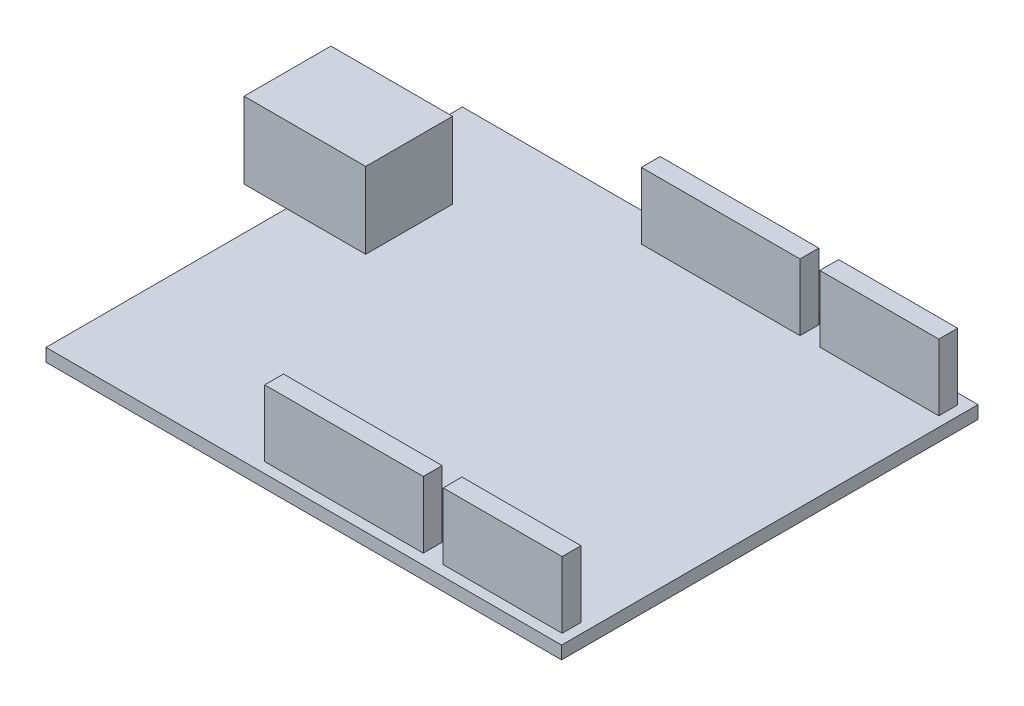
ISO-10303-21;
HEADER;
FILE_DESCRIPTION(('STEP AP214'),'2;1');
FILE_NAME('part.step','',(''),(''),'','','');
FILE_SCHEMA(('AUTOMOTIVE_DESIGN { 1 0 10303 214 1 1 1 1 }'));
ENDSEC;
DATA;
#1=APPLICATION_CONTEXT('core data for automotive mechanical design processes');
#2=APPLICATION_PROTOCOL_DEFINITION('international standard','automotive_design',2000,#1);
#3=PRODUCT_CONTEXT('',#1,'mechanical');
#4=PRODUCT('Part','Part','',(#3));
#5=PRODUCT_RELATED_PRODUCT_CATEGORY('part','',(#4));
#6=PRODUCT_DEFINITION_FORMATION('','',#4);
#7=PRODUCT_DEFINITION_CONTEXT('part definition',#1,'design');
#8=PRODUCT_DEFINITION('design','',#6,#7);
#9=PRODUCT_DEFINITION_SHAPE('','',#8);
#10=(LENGTH_UNIT() NAMED_UNIT(*) SI_UNIT(.MILLI.,.METRE.));
#11=(NAMED_UNIT(*) PLANE_ANGLE_UNIT() SI_UNIT($,.RADIAN.));
#12=(NAMED_UNIT(*) SI_UNIT($,.STERADIAN.) SOLID_ANGLE_UNIT());
#13=UNCERTAINTY_MEASURE_WITH_UNIT(LENGTH_MEASURE(1.E-05),#10,'distance_accuracy_value','');
#14=(GEOMETRIC_REPRESENTATION_CONTEXT(3) GLOBAL_UNCERTAINTY_ASSIGNED_CONTEXT((#13)) GLOBAL_UNIT_ASSIGNED_CONTEXT((#10,
#11,#12)) REPRESENTATION_CONTEXT('',''));
#15=CARTESIAN_POINT('',(0.,0.,0.));
#16=DIRECTION('',(0.,0.,1.));
#17=DIRECTION('',(1.,0.,0.));
#18=AXIS2_PLACEMENT_3D('',#15,#16,#17);
#19=CARTESIAN_POINT('',(0.,1.65,0.));
#20=DIRECTION('',(0.,1.,0.));
#21=DIRECTION('',(0.,0.,1.));
#22=AXIS2_PLACEMENT_3D('',#19,#20,#21);
#23=PLANE('',#22);
#24=DIRECTION('',(1.,0.,0.));
#25=VECTOR('',#24,1.);
#26=CARTESIAN_POINT('',(-38.45,1.65,-4.1313738611794));
#27=LINE('',#26,#25);
#28=CARTESIAN_POINT('',(-33.02,1.65,-4.13137386117941));
#29=VERTEX_POINT('',#28);
#30=CARTESIAN_POINT('',(-22.87,1.65,-4.1313738611794));
#31=VERTEX_POINT('',#30);
#32=EDGE_CURVE('E11',#29,#31,#27,.T.);
#33=ORIENTED_EDGE('',*,*,#32,.F.);
#34=DIRECTION('',(0.,0.,1.));
#35=VECTOR('',#34,1.);
#36=CARTESIAN_POINT('',(-33.02,1.65,-26.67));
#37=LINE('',#36,#35);
#38=CARTESIAN_POINT('',(-33.02,1.65,26.67));
#39=VERTEX_POINT('',#38);
#40=EDGE_CURVE('E480',#29,#39,#37,.T.);
#41=ORIENTED_EDGE('',*,*,#40,.T.);
#42=DIRECTION('',(1.,0.,0.));
#43=VECTOR('',#42,1.);
#44=CARTESIAN_POINT('',(-33.02,1.65,26.67));
#45=LINE('',#44,#43);
#46=CARTESIAN_POINT('',(33.02,1.65,26.67));
#47=VERTEX_POINT('',#46);
#48=EDGE_CURVE('E483',#39,#47,#45,.T.);
#49=ORIENTED_EDGE('',*,*,#48,.T.);
#50=DIRECTION('',(0.,0.,-1.));
#51=VECTOR('',#50,1.);
#52=CARTESIAN_POINT('',(33.02,1.65,-26.67));
#53=LINE('',#52,#51);
#54=CARTESIAN_POINT('',(33.02,1.65,-26.67));
#55=VERTEX_POINT('',#54);
#56=EDGE_CURVE('E474',#47,#55,#53,.T.);
#57=ORIENTED_EDGE('',*,*,#56,.T.);
#58=DIRECTION('',(-1.,0.,0.));
#59=VECTOR('',#58,1.);
#60=CARTESIAN_POINT('',(-33.02,1.65,-26.67));
#61=LINE('',#60,#59);
#62=CARTESIAN_POINT('',(-33.02,1.65,-26.67));
#63=VERTEX_POINT('',#62);
#64=EDGE_CURVE('E477',#55,#63,#61,.T.);
#65=ORIENTED_EDGE('',*,*,#64,.T.);
#66=CARTESIAN_POINT('',(-33.02,1.65,-15.2513738611794));
#67=VERTEX_POINT('',#66);
#68=EDGE_CURVE('E481',#63,#67,#37,.T.);
#69=ORIENTED_EDGE('',*,*,#68,.T.);
#70=DIRECTION('',(-1.,0.,0.));
#71=VECTOR('',#70,1.);
#72=CARTESIAN_POINT('',(-38.45,1.65,-15.2513738611794));
#73=LINE('',#72,#71);
#74=CARTESIAN_POINT('',(-22.87,1.65,-15.2513738611794));
#75=VERTEX_POINT('',#74);
#76=EDGE_CURVE('E456',#75,#67,#73,.T.);
#77=ORIENTED_EDGE('',*,*,#76,.F.);
#78=DIRECTION('',(0.,0.,-1.));
#79=VECTOR('',#78,1.);
#80=CARTESIAN_POINT('',(-22.87,1.65,-15.2513738611794));
#81=LINE('',#80,#79);
#82=EDGE_CURVE('E436',#31,#75,#81,.T.);
#83=ORIENTED_EDGE('',*,*,#82,.F.);
#84=EDGE_LOOP('',(#33,#41,#49,#57,#65,#69,#77,#83));
#85=FACE_BOUND('',#84,.T.);
#86=DIRECTION('',(1.,0.,0.));
#87=VECTOR('',#86,1.);
#88=CARTESIAN_POINT('',(16.51,1.65,25.33));
#89=LINE('',#88,#87);
#90=CARTESIAN_POINT('',(16.51,1.65,25.33));
#91=VERTEX_POINT('',#90);
#92=CARTESIAN_POINT('',(31.75,1.65,25.33));
#93=VERTEX_POINT('',#92);
#94=EDGE_CURVE('E362',#91,#93,#89,.T.);
#95=ORIENTED_EDGE('',*,*,#94,.F.);
#96=DIRECTION('',(0.,0.,1.));
#97=VECTOR('',#96,1.);
#98=CARTESIAN_POINT('',(16.51,1.65,25.33));
#99=LINE('',#98,#97);
#100=CARTESIAN_POINT('',(16.51,1.65,22.92));
#101=VERTEX_POINT('',#100);
#102=EDGE_CURVE('E318',#101,#91,#99,.T.);
#103=ORIENTED_EDGE('',*,*,#102,.F.);
#104=DIRECTION('',(-1.,0.,0.));
#105=VECTOR('',#104,1.);
#106=CARTESIAN_POINT('',(16.51,1.65,22.92));
#107=LINE('',#106,#105);
#108=CARTESIAN_POINT('',(31.75,1.65,22.92));
#109=VERTEX_POINT('',#108);
#110=EDGE_CURVE('E353',#109,#101,#107,.T.);
#111=ORIENTED_EDGE('',*,*,#110,.F.);
#112=DIRECTION('',(0.,0.,-1.));
#113=VECTOR('',#112,1.);
#114=CARTESIAN_POINT('',(31.75,1.65,25.33));
#115=LINE('',#114,#113);
#116=EDGE_CURVE('E364',#93,#109,#115,.T.);
#117=ORIENTED_EDGE('',*,*,#116,.F.);
#118=EDGE_LOOP('',(#95,#103,#111,#117));
#119=FACE_BOUND('',#118,.T.);
#120=DIRECTION('',(1.,0.,0.));
#121=VECTOR('',#120,1.);
#122=CARTESIAN_POINT('',(-6.34999999999999,1.65,-22.92));
#123=LINE('',#122,#121);
#124=CARTESIAN_POINT('',(-6.34999999999999,1.65,-22.92));
#125=VERTEX_POINT('',#124);
#126=CARTESIAN_POINT('',(13.97,1.65,-22.92));
#127=VERTEX_POINT('',#126);
#128=EDGE_CURVE('E283',#125,#127,#123,.T.);
#129=ORIENTED_EDGE('',*,*,#128,.F.);
#130=DIRECTION('',(0.,0.,1.));
#131=VECTOR('',#130,1.);
#132=CARTESIAN_POINT('',(-6.34999999999999,1.65,-25.33));
#133=LINE('',#132,#131);
#134=CARTESIAN_POINT('',(-6.34999999999999,1.65,-25.33));
#135=VERTEX_POINT('',#134);
#136=EDGE_CURVE('E277',#135,#125,#133,.T.);
#137=ORIENTED_EDGE('',*,*,#136,.F.);
#138=DIRECTION('',(-1.,0.,0.));
#139=VECTOR('',#138,1.);
#140=CARTESIAN_POINT('',(-6.34999999999999,1.65,-25.33));
#141=LINE('',#140,#139);
#142=CARTESIAN_POINT('',(13.97,1.65,-25.33));
#143=VERTEX_POINT('',#142);
#144=EDGE_CURVE('E258',#143,#135,#141,.T.);
#145=ORIENTED_EDGE('',*,*,#144,.F.);
#146=DIRECTION('',(0.,0.,-1.));
#147=VECTOR('',#146,1.);
#148=CARTESIAN_POINT('',(13.97,1.65,-25.33));
#149=LINE('',#148,#147);
#150=EDGE_CURVE('E270',#127,#143,#149,.T.);
#151=ORIENTED_EDGE('',*,*,#150,.F.);
#152=EDGE_LOOP('',(#129,#137,#145,#151));
#153=FACE_BOUND('',#152,.T.);
#154=DIRECTION('',(1.,0.,0.));
#155=VECTOR('',#154,1.);
#156=CARTESIAN_POINT('',(16.51,1.65,-22.92));
#157=LINE('',#156,#155);
#158=CARTESIAN_POINT('',(16.51,1.65,-22.92));
#159=VERTEX_POINT('',#158);
#160=CARTESIAN_POINT('',(31.75,1.65,-22.92));
#161=VERTEX_POINT('',#160);
#162=EDGE_CURVE('E338',#159,#161,#157,.T.);
#163=ORIENTED_EDGE('',*,*,#162,.F.);
#164=DIRECTION('',(0.,0.,1.));
#165=VECTOR('',#164,1.);
#166=CARTESIAN_POINT('',(16.51,1.65,-25.33));
#167=LINE('',#166,#165);
#168=CARTESIAN_POINT('',(16.51,1.65,-25.33));
#169=VERTEX_POINT('',#168);
#170=EDGE_CURVE('E300',#169,#159,#167,.T.);
#171=ORIENTED_EDGE('',*,*,#170,.F.);
#172=DIRECTION('',(-1.,0.,0.));
#173=VECTOR('',#172,1.);
#174=CARTESIAN_POINT('',(16.51,1.65,-25.33));
#175=LINE('',#174,#173);
#176=CARTESIAN_POINT('',(31.75,1.65,-25.33));
#177=VERTEX_POINT('',#176);
#178=EDGE_CURVE('E333',#177,#169,#175,.T.);
#179=ORIENTED_EDGE('',*,*,#178,.F.);
#180=DIRECTION('',(0.,0.,-1.));
#181=VECTOR('',#180,1.);
#182=CARTESIAN_POINT('',(31.75,1.65,-25.33));
#183=LINE('',#182,#181);
#184=EDGE_CURVE('E335',#161,#177,#183,.T.);
#185=ORIENTED_EDGE('',*,*,#184,.F.);
#186=EDGE_LOOP('',(#163,#171,#179,#185));
#187=FACE_BOUND('',#186,.T.);
#188=DIRECTION('',(1.,0.,0.));
#189=VECTOR('',#188,1.);
#190=CARTESIAN_POINT('',(-6.35,1.65,25.33));
#191=LINE('',#190,#189);
#192=CARTESIAN_POINT('',(-6.35,1.65,25.33));
#193=VERTEX_POINT('',#192);
#194=CARTESIAN_POINT('',(13.97,1.65,25.33));
#195=VERTEX_POINT('',#194);
#196=EDGE_CURVE('E313',#193,#195,#191,.T.);
#197=ORIENTED_EDGE('',*,*,#196,.F.);
#198=DIRECTION('',(0.,0.,1.));
#199=VECTOR('',#198,1.);
#200=CARTESIAN_POINT('',(-6.35,1.65,25.33));
#201=LINE('',#200,#199);
#202=CARTESIAN_POINT('',(-6.35,1.65,22.92));
#203=VERTEX_POINT('',#202);
#204=EDGE_CURVE('E315',#203,#193,#201,.T.);
#205=ORIENTED_EDGE('',*,*,#204,.F.);
#206=DIRECTION('',(-1.,0.,0.));
#207=VECTOR('',#206,1.);
#208=CARTESIAN_POINT('',(-6.35,1.65,22.92));
#209=LINE('',#208,#207);
#210=CARTESIAN_POINT('',(13.97,1.65,22.92));
#211=VERTEX_POINT('',#210);
#212=EDGE_CURVE('E308',#211,#203,#209,.T.);
#213=ORIENTED_EDGE('',*,*,#212,.F.);
#214=DIRECTION('',(0.,0.,-1.));
#215=VECTOR('',#214,1.);
#216=CARTESIAN_POINT('',(13.97,1.65,25.33));
#217=LINE('',#216,#215);
#218=EDGE_CURVE('E310',#195,#211,#217,.T.);
#219=ORIENTED_EDGE('',*,*,#218,.F.);
#220=EDGE_LOOP('',(#197,#205,#213,#219));
#221=FACE_BOUND('',#220,.T.);
#222=ADVANCED_FACE('F39',(#85,#119,#153,#187,#221),#23,.T.);
#223=CARTESIAN_POINT('',(33.02,1.65,-26.67));
#224=DIRECTION('',(-1.,0.,0.));
#225=DIRECTION('',(0.,0.,1.));
#226=AXIS2_PLACEMENT_3D('',#223,#224,#225);
#227=PLANE('',#226);
#228=DIRECTION('',(0.,0.,-1.));
#229=VECTOR('',#228,1.);
#230=CARTESIAN_POINT('',(33.02,0.,-26.67));
#231=LINE('',#230,#229);
#232=CARTESIAN_POINT('',(33.02,0.,26.67));
#233=VERTEX_POINT('',#232);
#234=CARTESIAN_POINT('',(33.02,0.,-26.67));
#235=VERTEX_POINT('',#234);
#236=EDGE_CURVE('E473',#233,#235,#231,.T.);
#237=ORIENTED_EDGE('',*,*,#236,.T.);
#238=DIRECTION('',(0.,-1.,0.));
#239=VECTOR('',#238,1.);
#240=CARTESIAN_POINT('',(33.02,1.65,-26.67));
#241=LINE('',#240,#239);
#242=EDGE_CURVE('E43',#55,#235,#241,.T.);
#243=ORIENTED_EDGE('',*,*,#242,.F.);
#244=ORIENTED_EDGE('',*,*,#56,.F.);
#245=DIRECTION('',(0.,-1.,0.));
#246=VECTOR('',#245,1.);
#247=CARTESIAN_POINT('',(33.02,1.65,26.67));
#248=LINE('',#247,#246);
#249=EDGE_CURVE('E486',#47,#233,#248,.T.);
#250=ORIENTED_EDGE('',*,*,#249,.T.);
#251=EDGE_LOOP('',(#237,#243,#244,#250));
#252=FACE_BOUND('',#251,.T.);
#253=ADVANCED_FACE('F41',(#252),#227,.F.);
#254=CARTESIAN_POINT('',(-33.02,1.65,-26.67));
#255=DIRECTION('',(0.,0.,1.));
#256=DIRECTION('',(1.,0.,0.));
#257=AXIS2_PLACEMENT_3D('',#254,#255,#256);
#258=PLANE('',#257);
#259=DIRECTION('',(-1.,0.,0.));
#260=VECTOR('',#259,1.);
#261=CARTESIAN_POINT('',(-33.02,0.,-26.67));
#262=LINE('',#261,#260);
#263=CARTESIAN_POINT('',(-33.02,0.,-26.67));
#264=VERTEX_POINT('',#263);
#265=EDGE_CURVE('E489',#235,#264,#262,.T.);
#266=ORIENTED_EDGE('',*,*,#265,.T.);
#267=DIRECTION('',(0.,-1.,0.));
#268=VECTOR('',#267,1.);
#269=CARTESIAN_POINT('',(-33.02,1.65,-26.67));
#270=LINE('',#269,#268);
#271=EDGE_CURVE('E498',#63,#264,#270,.T.);
#272=ORIENTED_EDGE('',*,*,#271,.F.);
#273=ORIENTED_EDGE('',*,*,#64,.F.);
#274=ORIENTED_EDGE('',*,*,#242,.T.);
#275=EDGE_LOOP('',(#266,#272,#273,#274));
#276=FACE_BOUND('',#275,.T.);
#277=ADVANCED_FACE('F507',(#276),#258,.F.);
#278=CARTESIAN_POINT('',(-33.02,1.65,-26.67));
#279=DIRECTION('',(1.,0.,0.));
#280=DIRECTION('',(0.,0.,-1.));
#281=AXIS2_PLACEMENT_3D('',#278,#279,#280);
#282=PLANE('',#281);
#283=DIRECTION('',(0.,0.,1.));
#284=VECTOR('',#283,1.);
#285=CARTESIAN_POINT('',(-33.02,0.,-26.67));
#286=LINE('',#285,#284);
#287=CARTESIAN_POINT('',(-33.02,0.,26.67));
#288=VERTEX_POINT('',#287);
#289=EDGE_CURVE('E491',#264,#288,#286,.T.);
#290=ORIENTED_EDGE('',*,*,#289,.T.);
#291=DIRECTION('',(0.,-1.,0.));
#292=VECTOR('',#291,1.);
#293=CARTESIAN_POINT('',(-33.02,1.65,26.67));
#294=LINE('',#293,#292);
#295=EDGE_CURVE('E496',#39,#288,#294,.T.);
#296=ORIENTED_EDGE('',*,*,#295,.F.);
#297=ORIENTED_EDGE('',*,*,#40,.F.);
#298=EDGE_CURVE('E484',#67,#29,#37,.T.);
#299=ORIENTED_EDGE('',*,*,#298,.F.);
#300=ORIENTED_EDGE('',*,*,#68,.F.);
#301=ORIENTED_EDGE('',*,*,#271,.T.);
#302=EDGE_LOOP('',(#290,#296,#297,#299,#300,#301));
#303=FACE_BOUND('',#302,.T.);
#304=ADVANCED_FACE('F516',(#303),#282,.F.);
#305=CARTESIAN_POINT('',(-33.02,1.65,26.67));
#306=DIRECTION('',(0.,0.,-1.));
#307=DIRECTION('',(-1.,0.,0.));
#308=AXIS2_PLACEMENT_3D('',#305,#306,#307);
#309=PLANE('',#308);
#310=DIRECTION('',(1.,0.,0.));
#311=VECTOR('',#310,1.);
#312=CARTESIAN_POINT('',(-33.02,0.,26.67));
#313=LINE('',#312,#311);
#314=EDGE_CURVE('E478',#288,#233,#313,.T.);
#315=ORIENTED_EDGE('',*,*,#314,.T.);
#316=ORIENTED_EDGE('',*,*,#249,.F.);
#317=ORIENTED_EDGE('',*,*,#48,.F.);
#318=ORIENTED_EDGE('',*,*,#295,.T.);
#319=EDGE_LOOP('',(#315,#316,#317,#318));
#320=FACE_BOUND('',#319,.T.);
#321=ADVANCED_FACE('F520',(#320),#309,.F.);
#322=CARTESIAN_POINT('',(0.,0.,0.));
#323=DIRECTION('',(0.,1.,0.));
#324=DIRECTION('',(0.,0.,1.));
#325=AXIS2_PLACEMENT_3D('',#322,#323,#324);
#326=PLANE('',#325);
#327=ORIENTED_EDGE('',*,*,#236,.F.);
#328=ORIENTED_EDGE('',*,*,#314,.F.);
#329=ORIENTED_EDGE('',*,*,#289,.F.);
#330=ORIENTED_EDGE('',*,*,#265,.F.);
#331=EDGE_LOOP('',(#327,#328,#329,#330));
#332=FACE_BOUND('',#331,.T.);
#333=ADVANCED_FACE('F514',(#332),#326,.F.);
#334=CARTESIAN_POINT('',(0.,1.65,0.));
#335=DIRECTION('',(0.,1.,0.));
#336=DIRECTION('',(0.,0.,1.));
#337=AXIS2_PLACEMENT_3D('',#334,#335,#336);
#338=PLANE('',#337);
#339=CARTESIAN_POINT('',(-38.45,1.65,-15.2513738611794));
#340=VERTEX_POINT('',#339);
#341=EDGE_CURVE('E455',#67,#340,#73,.T.);
#342=ORIENTED_EDGE('',*,*,#341,.F.);
#343=ORIENTED_EDGE('',*,*,#298,.T.);
#344=CARTESIAN_POINT('',(-38.45,1.65,-4.1313738611794));
#345=VERTEX_POINT('',#344);
#346=EDGE_CURVE('E49',#345,#29,#27,.T.);
#347=ORIENTED_EDGE('',*,*,#346,.F.);
#348=DIRECTION('',(0.,0.,1.));
#349=VECTOR('',#348,1.);
#350=CARTESIAN_POINT('',(-38.45,1.65,-15.2513738611794));
#351=LINE('',#350,#349);
#352=EDGE_CURVE('E459',#340,#345,#351,.T.);
#353=ORIENTED_EDGE('',*,*,#352,.F.);
#354=EDGE_LOOP('',(#342,#343,#347,#353));
#355=FACE_BOUND('',#354,.T.);
#356=ADVANCED_FACE('F528',(#355),#338,.F.);
#357=CARTESIAN_POINT('',(-22.87,11.4,-15.2513738611794));
#358=DIRECTION('',(-1.,0.,0.));
#359=DIRECTION('',(0.,0.,1.));
#360=AXIS2_PLACEMENT_3D('',#357,#358,#359);
#361=PLANE('',#360);
#362=ORIENTED_EDGE('',*,*,#82,.T.);
#363=DIRECTION('',(0.,-1.,0.));
#364=VECTOR('',#363,1.);
#365=CARTESIAN_POINT('',(-22.87,11.4,-15.2513738611794));
#366=LINE('',#365,#364);
#367=CARTESIAN_POINT('',(-22.87,11.4,-15.2513738611794));
#368=VERTEX_POINT('',#367);
#369=EDGE_CURVE('E470',#368,#75,#366,.T.);
#370=ORIENTED_EDGE('',*,*,#369,.F.);
#371=DIRECTION('',(0.,0.,-1.));
#372=VECTOR('',#371,1.);
#373=CARTESIAN_POINT('',(-22.87,11.4,-15.2513738611794));
#374=LINE('',#373,#372);
#375=CARTESIAN_POINT('',(-22.87,11.4,-4.1313738611794));
#376=VERTEX_POINT('',#375);
#377=EDGE_CURVE('E443',#376,#368,#374,.T.);
#378=ORIENTED_EDGE('',*,*,#377,.F.);
#379=DIRECTION('',(0.,-1.,0.));
#380=VECTOR('',#379,1.);
#381=CARTESIAN_POINT('',(-22.87,11.4,-4.1313738611794));
#382=LINE('',#381,#380);
#383=EDGE_CURVE('E452',#376,#31,#382,.T.);
#384=ORIENTED_EDGE('',*,*,#383,.T.);
#385=EDGE_LOOP('',(#362,#370,#378,#384));
#386=FACE_BOUND('',#385,.T.);
#387=ADVANCED_FACE('F543',(#386),#361,.F.);
#388=CARTESIAN_POINT('',(-38.45,11.4,-15.2513738611794));
#389=DIRECTION('',(0.,0.,1.));
#390=DIRECTION('',(1.,0.,0.));
#391=AXIS2_PLACEMENT_3D('',#388,#389,#390);
#392=PLANE('',#391);
#393=ORIENTED_EDGE('',*,*,#76,.T.);
#394=ORIENTED_EDGE('',*,*,#341,.T.);
#395=DIRECTION('',(0.,-1.,0.));
#396=VECTOR('',#395,1.);
#397=CARTESIAN_POINT('',(-38.45,11.4,-15.2513738611794));
#398=LINE('',#397,#396);
#399=CARTESIAN_POINT('',(-38.45,11.4,-15.2513738611794));
#400=VERTEX_POINT('',#399);
#401=EDGE_CURVE('E467',#400,#340,#398,.T.);
#402=ORIENTED_EDGE('',*,*,#401,.F.);
#403=DIRECTION('',(-1.,0.,0.));
#404=VECTOR('',#403,1.);
#405=CARTESIAN_POINT('',(-38.45,11.4,-15.2513738611794));
#406=LINE('',#405,#404);
#407=EDGE_CURVE('E446',#368,#400,#406,.T.);
#408=ORIENTED_EDGE('',*,*,#407,.F.);
#409=ORIENTED_EDGE('',*,*,#369,.T.);
#410=EDGE_LOOP('',(#393,#394,#402,#408,#409));
#411=FACE_BOUND('',#410,.T.);
#412=ADVANCED_FACE('F540',(#411),#392,.F.);
#413=CARTESIAN_POINT('',(-38.45,11.4,-15.2513738611794));
#414=DIRECTION('',(1.,0.,0.));
#415=DIRECTION('',(0.,0.,-1.));
#416=AXIS2_PLACEMENT_3D('',#413,#414,#415);
#417=PLANE('',#416);
#418=DIRECTION('',(0.,0.,-1.));
#419=VECTOR('',#418,1.);
#420=CARTESIAN_POINT('',(-38.45,9.80413449394737,-13.8313738611794));
#421=LINE('',#420,#419);
#422=CARTESIAN_POINT('',(-38.45,9.80413449394737,-5.5313738611794));
#423=VERTEX_POINT('',#422);
#424=CARTESIAN_POINT('',(-38.45,9.80413449394737,-13.8313738611794));
#425=VERTEX_POINT('',#424);
#426=EDGE_CURVE('E426',#423,#425,#421,.T.);
#427=ORIENTED_EDGE('',*,*,#426,.F.);
#428=DIRECTION('',(0.,1.,0.));
#429=VECTOR('',#428,1.);
#430=CARTESIAN_POINT('',(-38.45,9.80413449394737,-5.5313738611794));
#431=LINE('',#430,#429);
#432=CARTESIAN_POINT('',(-38.45,2.59999999999999,-5.5313738611794));
#433=VERTEX_POINT('',#432);
#434=EDGE_CURVE('E404',#433,#423,#431,.T.);
#435=ORIENTED_EDGE('',*,*,#434,.F.);
#436=DIRECTION('',(0.,0.,1.));
#437=VECTOR('',#436,1.);
#438=CARTESIAN_POINT('',(-38.45,2.59999999999999,-13.8313738611794));
#439=LINE('',#438,#437);
#440=CARTESIAN_POINT('',(-38.45,2.59999999999999,-13.8313738611794));
#441=VERTEX_POINT('',#440);
#442=EDGE_CURVE('E415',#441,#433,#439,.T.);
#443=ORIENTED_EDGE('',*,*,#442,.F.);
#444=DIRECTION('',(0.,-1.,0.));
#445=VECTOR('',#444,1.);
#446=CARTESIAN_POINT('',(-38.45,9.80413449394737,-13.8313738611794));
#447=LINE('',#446,#445);
#448=EDGE_CURVE('E429',#425,#441,#447,.T.);
#449=ORIENTED_EDGE('',*,*,#448,.F.);
#450=EDGE_LOOP('',(#427,#435,#443,#449));
#451=FACE_BOUND('',#450,.T.);
#452=ORIENTED_EDGE('',*,*,#352,.T.);
#453=DIRECTION('',(0.,-1.,0.));
#454=VECTOR('',#453,1.);
#455=CARTESIAN_POINT('',(-38.45,11.4,-4.1313738611794));
#456=LINE('',#455,#454);
#457=CARTESIAN_POINT('',(-38.45,11.4,-4.1313738611794));
#458=VERTEX_POINT('',#457);
#459=EDGE_CURVE('E464',#458,#345,#456,.T.);
#460=ORIENTED_EDGE('',*,*,#459,.F.);
#461=DIRECTION('',(0.,0.,1.));
#462=VECTOR('',#461,1.);
#463=CARTESIAN_POINT('',(-38.45,11.4,-15.2513738611794));
#464=LINE('',#463,#462);
#465=EDGE_CURVE('E448',#400,#458,#464,.T.);
#466=ORIENTED_EDGE('',*,*,#465,.F.);
#467=ORIENTED_EDGE('',*,*,#401,.T.);
#468=EDGE_LOOP('',(#452,#460,#466,#467));
#469=FACE_BOUND('',#468,.T.);
#470=ADVANCED_FACE('F537',(#451,#469),#417,.F.);
#471=CARTESIAN_POINT('',(-38.45,11.4,-4.1313738611794));
#472=DIRECTION('',(0.,0.,-1.));
#473=DIRECTION('',(-1.,0.,0.));
#474=AXIS2_PLACEMENT_3D('',#471,#472,#473);
#475=PLANE('',#474);
#476=ORIENTED_EDGE('',*,*,#346,.T.);
#477=ORIENTED_EDGE('',*,*,#32,.T.);
#478=ORIENTED_EDGE('',*,*,#383,.F.);
#479=DIRECTION('',(1.,0.,0.));
#480=VECTOR('',#479,1.);
#481=CARTESIAN_POINT('',(-38.45,11.4,-4.1313738611794));
#482=LINE('',#481,#480);
#483=EDGE_CURVE('E450',#458,#376,#482,.T.);
#484=ORIENTED_EDGE('',*,*,#483,.F.);
#485=ORIENTED_EDGE('',*,*,#459,.T.);
#486=EDGE_LOOP('',(#476,#477,#478,#484,#485));
#487=FACE_BOUND('',#486,.T.);
#488=ADVANCED_FACE('F531',(#487),#475,.F.);
#489=CARTESIAN_POINT('',(0.,11.4,0.));
#490=DIRECTION('',(0.,1.,0.));
#491=DIRECTION('',(0.,0.,1.));
#492=AXIS2_PLACEMENT_3D('',#489,#490,#491);
#493=PLANE('',#492);
#494=ORIENTED_EDGE('',*,*,#377,.T.);
#495=ORIENTED_EDGE('',*,*,#407,.T.);
#496=ORIENTED_EDGE('',*,*,#465,.T.);
#497=ORIENTED_EDGE('',*,*,#483,.T.);
#498=EDGE_LOOP('',(#494,#495,#496,#497));
#499=FACE_BOUND('',#498,.T.);
#500=ADVANCED_FACE('F546',(#499),#493,.T.);
#501=CARTESIAN_POINT('',(-28.7,9.80413449394737,-5.5313738611794));
#502=DIRECTION('',(0.,0.,1.));
#503=DIRECTION('',(0.,-1.,0.));
#504=AXIS2_PLACEMENT_3D('',#501,#502,#503);
#505=PLANE('',#504);
#506=ORIENTED_EDGE('',*,*,#434,.T.);
#507=DIRECTION('',(-1.,0.,0.));
#508=VECTOR('',#507,1.);
#509=CARTESIAN_POINT('',(-28.7,9.80413449394737,-5.5313738611794));
#510=LINE('',#509,#508);
#511=CARTESIAN_POINT('',(-28.7,9.80413449394737,-5.5313738611794));
#512=VERTEX_POINT('',#511);
#513=EDGE_CURVE('E424',#512,#423,#510,.T.);
#514=ORIENTED_EDGE('',*,*,#513,.F.);
#515=DIRECTION('',(0.,1.,0.));
#516=VECTOR('',#515,1.);
#517=CARTESIAN_POINT('',(-28.7,9.80413449394737,-5.5313738611794));
#518=LINE('',#517,#516);
#519=CARTESIAN_POINT('',(-28.7,2.59999999999999,-5.5313738611794));
#520=VERTEX_POINT('',#519);
#521=EDGE_CURVE('E411',#520,#512,#518,.T.);
#522=ORIENTED_EDGE('',*,*,#521,.F.);
#523=DIRECTION('',(-1.,0.,0.));
#524=VECTOR('',#523,1.);
#525=CARTESIAN_POINT('',(-28.7,2.59999999999999,-5.5313738611794));
#526=LINE('',#525,#524);
#527=EDGE_CURVE('E434',#520,#433,#526,.T.);
#528=ORIENTED_EDGE('',*,*,#527,.T.);
#529=EDGE_LOOP('',(#506,#514,#522,#528));
#530=FACE_BOUND('',#529,.T.);
#531=ADVANCED_FACE('F548',(#530),#505,.F.);
#532=CARTESIAN_POINT('',(-28.7,2.59999999999999,-13.8313738611794));
#533=DIRECTION('',(0.,-1.,0.));
#534=DIRECTION('',(0.,0.,-1.));
#535=AXIS2_PLACEMENT_3D('',#532,#533,#534);
#536=PLANE('',#535);
#537=ORIENTED_EDGE('',*,*,#442,.T.);
#538=ORIENTED_EDGE('',*,*,#527,.F.);
#539=DIRECTION('',(0.,0.,1.));
#540=VECTOR('',#539,1.);
#541=CARTESIAN_POINT('',(-28.7,2.59999999999999,-13.8313738611794));
#542=LINE('',#541,#540);
#543=CARTESIAN_POINT('',(-28.7,2.59999999999999,-13.8313738611794));
#544=VERTEX_POINT('',#543);
#545=EDGE_CURVE('E421',#544,#520,#542,.T.);
#546=ORIENTED_EDGE('',*,*,#545,.F.);
#547=DIRECTION('',(-1.,0.,0.));
#548=VECTOR('',#547,1.);
#549=CARTESIAN_POINT('',(-28.7,2.59999999999999,-13.8313738611794));
#550=LINE('',#549,#548);
#551=EDGE_CURVE('E437',#544,#441,#550,.T.);
#552=ORIENTED_EDGE('',*,*,#551,.T.);
#553=EDGE_LOOP('',(#537,#538,#546,#552));
#554=FACE_BOUND('',#553,.T.);
#555=ADVANCED_FACE('F555',(#554),#536,.F.);
#556=CARTESIAN_POINT('',(-28.7,9.80413449394737,-13.8313738611794));
#557=DIRECTION('',(0.,0.,-1.));
#558=DIRECTION('',(0.,1.,0.));
#559=AXIS2_PLACEMENT_3D('',#556,#557,#558);
#560=PLANE('',#559);
#561=ORIENTED_EDGE('',*,*,#448,.T.);
#562=ORIENTED_EDGE('',*,*,#551,.F.);
#563=DIRECTION('',(0.,-1.,0.));
#564=VECTOR('',#563,1.);
#565=CARTESIAN_POINT('',(-28.7,9.80413449394737,-13.8313738611794));
#566=LINE('',#565,#564);
#567=CARTESIAN_POINT('',(-28.7,9.80413449394737,-13.8313738611794));
#568=VERTEX_POINT('',#567);
#569=EDGE_CURVE('E418',#568,#544,#566,.T.);
#570=ORIENTED_EDGE('',*,*,#569,.F.);
#571=DIRECTION('',(-1.,0.,0.));
#572=VECTOR('',#571,1.);
#573=CARTESIAN_POINT('',(-28.7,9.80413449394737,-13.8313738611794));
#574=LINE('',#573,#572);
#575=EDGE_CURVE('E439',#568,#425,#574,.T.);
#576=ORIENTED_EDGE('',*,*,#575,.T.);
#577=EDGE_LOOP('',(#561,#562,#570,#576));
#578=FACE_BOUND('',#577,.T.);
#579=ADVANCED_FACE('F652',(#578),#560,.F.);
#580=CARTESIAN_POINT('',(-28.7,9.80413449394737,-13.8313738611794));
#581=DIRECTION('',(0.,1.,0.));
#582=DIRECTION('',(0.,0.,1.));
#583=AXIS2_PLACEMENT_3D('',#580,#581,#582);
#584=PLANE('',#583);
#585=ORIENTED_EDGE('',*,*,#426,.T.);
#586=ORIENTED_EDGE('',*,*,#575,.F.);
#587=DIRECTION('',(0.,0.,-1.));
#588=VECTOR('',#587,1.);
#589=CARTESIAN_POINT('',(-28.7,9.80413449394737,-13.8313738611794));
#590=LINE('',#589,#588);
#591=EDGE_CURVE('E414',#512,#568,#590,.T.);
#592=ORIENTED_EDGE('',*,*,#591,.F.);
#593=ORIENTED_EDGE('',*,*,#513,.T.);
#594=EDGE_LOOP('',(#585,#586,#592,#593));
#595=FACE_BOUND('',#594,.T.);
#596=ADVANCED_FACE('F662',(#595),#584,.F.);
#597=CARTESIAN_POINT('',(-28.7,0.,0.));
#598=DIRECTION('',(-1.,0.,0.));
#599=DIRECTION('',(0.,0.,1.));
#600=AXIS2_PLACEMENT_3D('',#597,#598,#599);
#601=PLANE('',#600);
#602=DIRECTION('',(0.,0.,1.));
#603=VECTOR('',#602,1.);
#604=CARTESIAN_POINT('',(-28.7,4.83206724697368,-12.2613738611794));
#605=LINE('',#604,#603);
#606=CARTESIAN_POINT('',(-28.7,4.83206724697368,-12.2613738611794));
#607=VERTEX_POINT('',#606);
#608=CARTESIAN_POINT('',(-28.7,4.83206724697368,-7.1013738611794));
#609=VERTEX_POINT('',#608);
#610=EDGE_CURVE('E388',#607,#609,#605,.T.);
#611=ORIENTED_EDGE('',*,*,#610,.F.);
#612=DIRECTION('',(0.,-1.,0.));
#613=VECTOR('',#612,1.);
#614=CARTESIAN_POINT('',(-28.7,7.57206724697368,-12.2613738611794));
#615=LINE('',#614,#613);
#616=CARTESIAN_POINT('',(-28.7,7.57206724697368,-12.2613738611794));
#617=VERTEX_POINT('',#616);
#618=EDGE_CURVE('E385',#617,#607,#615,.T.);
#619=ORIENTED_EDGE('',*,*,#618,.F.);
#620=DIRECTION('',(0.,0.,-1.));
#621=VECTOR('',#620,1.);
#622=CARTESIAN_POINT('',(-28.7,7.57206724697368,-12.2613738611794));
#623=LINE('',#622,#621);
#624=CARTESIAN_POINT('',(-28.7,7.57206724697368,-7.1013738611794));
#625=VERTEX_POINT('',#624);
#626=EDGE_CURVE('E381',#625,#617,#623,.T.);
#627=ORIENTED_EDGE('',*,*,#626,.F.);
#628=DIRECTION('',(0.,1.,0.));
#629=VECTOR('',#628,1.);
#630=CARTESIAN_POINT('',(-28.7,7.57206724697368,-7.1013738611794));
#631=LINE('',#630,#629);
#632=EDGE_CURVE('E378',#609,#625,#631,.T.);
#633=ORIENTED_EDGE('',*,*,#632,.F.);
#634=EDGE_LOOP('',(#611,#619,#627,#633));
#635=FACE_BOUND('',#634,.T.);
#636=ORIENTED_EDGE('',*,*,#521,.T.);
#637=ORIENTED_EDGE('',*,*,#591,.T.);
#638=ORIENTED_EDGE('',*,*,#569,.T.);
#639=ORIENTED_EDGE('',*,*,#545,.T.);
#640=EDGE_LOOP('',(#636,#637,#638,#639));
#641=FACE_BOUND('',#640,.T.);
#642=ADVANCED_FACE('F672',(#635,#641),#601,.T.);
#643=CARTESIAN_POINT('',(-28.7,7.57206724697368,-7.1013738611794));
#644=DIRECTION('',(0.,0.,1.));
#645=DIRECTION('',(1.,0.,0.));
#646=AXIS2_PLACEMENT_3D('',#643,#644,#645);
#647=PLANE('',#646);
#648=DIRECTION('',(0.,1.,0.));
#649=VECTOR('',#648,1.);
#650=CARTESIAN_POINT('',(-38.45,7.57206724697368,-7.1013738611794));
#651=LINE('',#650,#649);
#652=CARTESIAN_POINT('',(-38.45,4.83206724697368,-7.1013738611794));
#653=VERTEX_POINT('',#652);
#654=CARTESIAN_POINT('',(-38.45,7.57206724697368,-7.1013738611794));
#655=VERTEX_POINT('',#654);
#656=EDGE_CURVE('E377',#653,#655,#651,.T.);
#657=ORIENTED_EDGE('',*,*,#656,.F.);
#658=DIRECTION('',(-1.,0.,0.));
#659=VECTOR('',#658,1.);
#660=CARTESIAN_POINT('',(-28.7,4.83206724697368,-7.1013738611794));
#661=LINE('',#660,#659);
#662=EDGE_CURVE('E402',#609,#653,#661,.T.);
#663=ORIENTED_EDGE('',*,*,#662,.F.);
#664=ORIENTED_EDGE('',*,*,#632,.T.);
#665=DIRECTION('',(-1.,0.,0.));
#666=VECTOR('',#665,1.);
#667=CARTESIAN_POINT('',(-28.7,7.57206724697368,-7.1013738611794));
#668=LINE('',#667,#666);
#669=EDGE_CURVE('E391',#625,#655,#668,.T.);
#670=ORIENTED_EDGE('',*,*,#669,.T.);
#671=EDGE_LOOP('',(#657,#663,#664,#670));
#672=FACE_BOUND('',#671,.T.);
#673=ADVANCED_FACE('F682',(#672),#647,.T.);
#674=CARTESIAN_POINT('',(-28.7,4.83206724697368,-12.2613738611794));
#675=DIRECTION('',(0.,-1.,0.));
#676=DIRECTION('',(0.,0.,-1.));
#677=AXIS2_PLACEMENT_3D('',#674,#675,#676);
#678=PLANE('',#677);
#679=DIRECTION('',(0.,0.,1.));
#680=VECTOR('',#679,1.);
#681=CARTESIAN_POINT('',(-38.45,4.83206724697368,-12.2613738611794));
#682=LINE('',#681,#680);
#683=CARTESIAN_POINT('',(-38.45,4.83206724697368,-12.2613738611794));
#684=VERTEX_POINT('',#683);
#685=EDGE_CURVE('E382',#684,#653,#682,.T.);
#686=ORIENTED_EDGE('',*,*,#685,.F.);
#687=DIRECTION('',(-1.,0.,0.));
#688=VECTOR('',#687,1.);
#689=CARTESIAN_POINT('',(-28.7,4.83206724697368,-12.2613738611794));
#690=LINE('',#689,#688);
#691=EDGE_CURVE('E405',#607,#684,#690,.T.);
#692=ORIENTED_EDGE('',*,*,#691,.F.);
#693=ORIENTED_EDGE('',*,*,#610,.T.);
#694=ORIENTED_EDGE('',*,*,#662,.T.);
#695=EDGE_LOOP('',(#686,#692,#693,#694));
#696=FACE_BOUND('',#695,.T.);
#697=ADVANCED_FACE('F692',(#696),#678,.T.);
#698=CARTESIAN_POINT('',(-28.7,7.57206724697368,-12.2613738611794));
#699=DIRECTION('',(0.,0.,-1.));
#700=DIRECTION('',(-1.,0.,0.));
#701=AXIS2_PLACEMENT_3D('',#698,#699,#700);
#702=PLANE('',#701);
#703=DIRECTION('',(0.,-1.,0.));
#704=VECTOR('',#703,1.);
#705=CARTESIAN_POINT('',(-38.45,7.57206724697368,-12.2613738611794));
#706=LINE('',#705,#704);
#707=CARTESIAN_POINT('',(-38.45,7.57206724697368,-12.2613738611794));
#708=VERTEX_POINT('',#707);
#709=EDGE_CURVE('E397',#708,#684,#706,.T.);
#710=ORIENTED_EDGE('',*,*,#709,.F.);
#711=DIRECTION('',(-1.,0.,0.));
#712=VECTOR('',#711,1.);
#713=CARTESIAN_POINT('',(-28.7,7.57206724697368,-12.2613738611794));
#714=LINE('',#713,#712);
#715=EDGE_CURVE('E407',#617,#708,#714,.T.);
#716=ORIENTED_EDGE('',*,*,#715,.F.);
#717=ORIENTED_EDGE('',*,*,#618,.T.);
#718=ORIENTED_EDGE('',*,*,#691,.T.);
#719=EDGE_LOOP('',(#710,#716,#717,#718));
#720=FACE_BOUND('',#719,.T.);
#721=ADVANCED_FACE('F702',(#720),#702,.T.);
#722=CARTESIAN_POINT('',(-28.7,7.57206724697368,-12.2613738611794));
#723=DIRECTION('',(0.,1.,0.));
#724=DIRECTION('',(0.,0.,1.));
#725=AXIS2_PLACEMENT_3D('',#722,#723,#724);
#726=PLANE('',#725);
#727=DIRECTION('',(0.,0.,-1.));
#728=VECTOR('',#727,1.);
#729=CARTESIAN_POINT('',(-38.45,7.57206724697368,-12.2613738611794));
#730=LINE('',#729,#728);
#731=EDGE_CURVE('E394',#655,#708,#730,.T.);
#732=ORIENTED_EDGE('',*,*,#731,.F.);
#733=ORIENTED_EDGE('',*,*,#669,.F.);
#734=ORIENTED_EDGE('',*,*,#626,.T.);
#735=ORIENTED_EDGE('',*,*,#715,.T.);
#736=EDGE_LOOP('',(#732,#733,#734,#735));
#737=FACE_BOUND('',#736,.T.);
#738=ADVANCED_FACE('F637',(#737),#726,.T.);
#739=ORIENTED_EDGE('',*,*,#656,.T.);
#740=ORIENTED_EDGE('',*,*,#731,.T.);
#741=ORIENTED_EDGE('',*,*,#709,.T.);
#742=ORIENTED_EDGE('',*,*,#685,.T.);
#743=EDGE_LOOP('',(#739,#740,#741,#742));
#744=FACE_BOUND('',#743,.T.);
#745=ADVANCED_FACE('F632',(#744),#417,.F.);
#746=CARTESIAN_POINT('',(16.51,10.16,25.33));
#747=DIRECTION('',(1.,0.,0.));
#748=DIRECTION('',(0.,0.,-1.));
#749=AXIS2_PLACEMENT_3D('',#746,#747,#748);
#750=PLANE('',#749);
#751=ORIENTED_EDGE('',*,*,#102,.T.);
#752=DIRECTION('',(0.,-1.,0.));
#753=VECTOR('',#752,1.);
#754=CARTESIAN_POINT('',(16.51,10.16,25.33));
#755=LINE('',#754,#753);
#756=CARTESIAN_POINT('',(16.51,10.16,25.33));
#757=VERTEX_POINT('',#756);
#758=EDGE_CURVE('E375',#757,#91,#755,.T.);
#759=ORIENTED_EDGE('',*,*,#758,.F.);
#760=DIRECTION('',(0.,0.,1.));
#761=VECTOR('',#760,1.);
#762=CARTESIAN_POINT('',(16.51,10.16,25.33));
#763=LINE('',#762,#761);
#764=CARTESIAN_POINT('',(16.51,10.16,22.92));
#765=VERTEX_POINT('',#764);
#766=EDGE_CURVE('E349',#765,#757,#763,.T.);
#767=ORIENTED_EDGE('',*,*,#766,.F.);
#768=DIRECTION('',(0.,-1.,0.));
#769=VECTOR('',#768,1.);
#770=CARTESIAN_POINT('',(16.51,10.16,22.92));
#771=LINE('',#770,#769);
#772=EDGE_CURVE('E359',#765,#101,#771,.T.);
#773=ORIENTED_EDGE('',*,*,#772,.T.);
#774=EDGE_LOOP('',(#751,#759,#767,#773));
#775=FACE_BOUND('',#774,.T.);
#776=ADVANCED_FACE('F636',(#775),#750,.F.);
#777=CARTESIAN_POINT('',(16.51,10.16,25.33));
#778=DIRECTION('',(0.,0.,-1.));
#779=DIRECTION('',(-1.,0.,0.));
#780=AXIS2_PLACEMENT_3D('',#777,#778,#779);
#781=PLANE('',#780);
#782=ORIENTED_EDGE('',*,*,#94,.T.);
#783=DIRECTION('',(0.,-1.,0.));
#784=VECTOR('',#783,1.);
#785=CARTESIAN_POINT('',(31.75,10.16,25.33));
#786=LINE('',#785,#784);
#787=CARTESIAN_POINT('',(31.75,10.16,25.33));
#788=VERTEX_POINT('',#787);
#789=EDGE_CURVE('E372',#788,#93,#786,.T.);
#790=ORIENTED_EDGE('',*,*,#789,.F.);
#791=DIRECTION('',(1.,0.,0.));
#792=VECTOR('',#791,1.);
#793=CARTESIAN_POINT('',(16.51,10.16,25.33));
#794=LINE('',#793,#792);
#795=EDGE_CURVE('E352',#757,#788,#794,.T.);
#796=ORIENTED_EDGE('',*,*,#795,.F.);
#797=ORIENTED_EDGE('',*,*,#758,.T.);
#798=EDGE_LOOP('',(#782,#790,#796,#797));
#799=FACE_BOUND('',#798,.T.);
#800=ADVANCED_FACE('F733',(#799),#781,.F.);
#801=CARTESIAN_POINT('',(31.75,10.16,25.33));
#802=DIRECTION('',(-1.,0.,0.));
#803=DIRECTION('',(0.,0.,1.));
#804=AXIS2_PLACEMENT_3D('',#801,#802,#803);
#805=PLANE('',#804);
#806=ORIENTED_EDGE('',*,*,#116,.T.);
#807=DIRECTION('',(0.,-1.,0.));
#808=VECTOR('',#807,1.);
#809=CARTESIAN_POINT('',(31.75,10.16,22.92));
#810=LINE('',#809,#808);
#811=CARTESIAN_POINT('',(31.75,10.16,22.92));
#812=VERTEX_POINT('',#811);
#813=EDGE_CURVE('E370',#812,#109,#810,.T.);
#814=ORIENTED_EDGE('',*,*,#813,.F.);
#815=DIRECTION('',(0.,0.,-1.));
#816=VECTOR('',#815,1.);
#817=CARTESIAN_POINT('',(31.75,10.16,25.33));
#818=LINE('',#817,#816);
#819=EDGE_CURVE('E355',#788,#812,#818,.T.);
#820=ORIENTED_EDGE('',*,*,#819,.F.);
#821=ORIENTED_EDGE('',*,*,#789,.T.);
#822=EDGE_LOOP('',(#806,#814,#820,#821));
#823=FACE_BOUND('',#822,.T.);
#824=ADVANCED_FACE('F743',(#823),#805,.F.);
#825=CARTESIAN_POINT('',(16.51,10.16,22.92));
#826=DIRECTION('',(0.,0.,1.));
#827=DIRECTION('',(1.,0.,0.));
#828=AXIS2_PLACEMENT_3D('',#825,#826,#827);
#829=PLANE('',#828);
#830=ORIENTED_EDGE('',*,*,#110,.T.);
#831=ORIENTED_EDGE('',*,*,#772,.F.);
#832=DIRECTION('',(-1.,0.,0.));
#833=VECTOR('',#832,1.);
#834=CARTESIAN_POINT('',(16.51,10.16,22.92));
#835=LINE('',#834,#833);
#836=EDGE_CURVE('E357',#812,#765,#835,.T.);
#837=ORIENTED_EDGE('',*,*,#836,.F.);
#838=ORIENTED_EDGE('',*,*,#813,.T.);
#839=EDGE_LOOP('',(#830,#831,#837,#838));
#840=FACE_BOUND('',#839,.T.);
#841=ADVANCED_FACE('F753',(#840),#829,.F.);
#842=CARTESIAN_POINT('',(0.,10.16,0.));
#843=DIRECTION('',(0.,-1.,0.));
#844=DIRECTION('',(0.,0.,-1.));
#845=AXIS2_PLACEMENT_3D('',#842,#843,#844);
#846=PLANE('',#845);
#847=ORIENTED_EDGE('',*,*,#766,.T.);
#848=ORIENTED_EDGE('',*,*,#795,.T.);
#849=ORIENTED_EDGE('',*,*,#819,.T.);
#850=ORIENTED_EDGE('',*,*,#836,.T.);
#851=EDGE_LOOP('',(#847,#848,#849,#850));
#852=FACE_BOUND('',#851,.T.);
#853=ADVANCED_FACE('F763',(#852),#846,.F.);
#854=CARTESIAN_POINT('',(-6.34999999999999,10.16,-25.33));
#855=DIRECTION('',(1.,0.,0.));
#856=DIRECTION('',(0.,0.,-1.));
#857=AXIS2_PLACEMENT_3D('',#854,#855,#856);
#858=PLANE('',#857);
#859=ORIENTED_EDGE('',*,*,#136,.T.);
#860=DIRECTION('',(0.,-1.,0.));
#861=VECTOR('',#860,1.);
#862=CARTESIAN_POINT('',(-6.34999999999999,10.16,-22.92));
#863=LINE('',#862,#861);
#864=CARTESIAN_POINT('',(-6.34999999999999,10.16,-22.92));
#865=VERTEX_POINT('',#864);
#866=EDGE_CURVE('E940',#865,#125,#863,.T.);
#867=ORIENTED_EDGE('',*,*,#866,.F.);
#868=DIRECTION('',(0.,0.,1.));
#869=VECTOR('',#868,1.);
#870=CARTESIAN_POINT('',(-6.34999999999999,10.16,-25.33));
#871=LINE('',#870,#869);
#872=CARTESIAN_POINT('',(-6.34999999999999,10.16,-25.33));
#873=VERTEX_POINT('',#872);
#874=EDGE_CURVE('E271',#873,#865,#871,.T.);
#875=ORIENTED_EDGE('',*,*,#874,.F.);
#876=DIRECTION('',(0.,-1.,0.));
#877=VECTOR('',#876,1.);
#878=CARTESIAN_POINT('',(-6.34999999999999,10.16,-25.33));
#879=LINE('',#878,#877);
#880=EDGE_CURVE('E262',#873,#135,#879,.T.);
#881=ORIENTED_EDGE('',*,*,#880,.T.);
#882=EDGE_LOOP('',(#859,#867,#875,#881));
#883=FACE_BOUND('',#882,.T.);
#884=ADVANCED_FACE('F275',(#883),#858,.F.);
#885=CARTESIAN_POINT('',(-6.34999999999999,10.16,-22.92));
#886=DIRECTION('',(0.,0.,-1.));
#887=DIRECTION('',(-1.,0.,0.));
#888=AXIS2_PLACEMENT_3D('',#885,#886,#887);
#889=PLANE('',#888);
#890=ORIENTED_EDGE('',*,*,#128,.T.);
#891=DIRECTION('',(0.,-1.,0.));
#892=VECTOR('',#891,1.);
#893=CARTESIAN_POINT('',(13.97,10.16,-22.92));
#894=LINE('',#893,#892);
#895=CARTESIAN_POINT('',(13.97,10.16,-22.92));
#896=VERTEX_POINT('',#895);
#897=EDGE_CURVE('E941',#896,#127,#894,.T.);
#898=ORIENTED_EDGE('',*,*,#897,.F.);
#899=DIRECTION('',(1.,0.,0.));
#900=VECTOR('',#899,1.);
#901=CARTESIAN_POINT('',(-6.34999999999999,10.16,-22.92));
#902=LINE('',#901,#900);
#903=EDGE_CURVE('E294',#865,#896,#902,.T.);
#904=ORIENTED_EDGE('',*,*,#903,.F.);
#905=ORIENTED_EDGE('',*,*,#866,.T.);
#906=EDGE_LOOP('',(#890,#898,#904,#905));
#907=FACE_BOUND('',#906,.T.);
#908=ADVANCED_FACE('F782',(#907),#889,.F.);
#909=CARTESIAN_POINT('',(13.97,10.16,-25.33));
#910=DIRECTION('',(-1.,0.,0.));
#911=DIRECTION('',(0.,0.,1.));
#912=AXIS2_PLACEMENT_3D('',#909,#910,#911);
#913=PLANE('',#912);
#914=ORIENTED_EDGE('',*,*,#150,.T.);
#915=DIRECTION('',(0.,-1.,0.));
#916=VECTOR('',#915,1.);
#917=CARTESIAN_POINT('',(13.97,10.16,-25.33));
#918=LINE('',#917,#916);
#919=CARTESIAN_POINT('',(13.97,10.16,-25.33));
#920=VERTEX_POINT('',#919);
#921=EDGE_CURVE('E265',#920,#143,#918,.T.);
#922=ORIENTED_EDGE('',*,*,#921,.F.);
#923=DIRECTION('',(0.,0.,-1.));
#924=VECTOR('',#923,1.);
#925=CARTESIAN_POINT('',(13.97,10.16,-25.33));
#926=LINE('',#925,#924);
#927=EDGE_CURVE('E292',#896,#920,#926,.T.);
#928=ORIENTED_EDGE('',*,*,#927,.F.);
#929=ORIENTED_EDGE('',*,*,#897,.T.);
#930=EDGE_LOOP('',(#914,#922,#928,#929));
#931=FACE_BOUND('',#930,.T.);
#932=ADVANCED_FACE('F791',(#931),#913,.F.);
#933=CARTESIAN_POINT('',(-6.34999999999999,10.16,-25.33));
#934=DIRECTION('',(0.,0.,1.));
#935=DIRECTION('',(1.,0.,0.));
#936=AXIS2_PLACEMENT_3D('',#933,#934,#935);
#937=PLANE('',#936);
#938=ORIENTED_EDGE('',*,*,#144,.T.);
#939=ORIENTED_EDGE('',*,*,#880,.F.);
#940=DIRECTION('',(-1.,0.,0.));
#941=VECTOR('',#940,1.);
#942=CARTESIAN_POINT('',(-6.34999999999999,10.16,-25.33));
#943=LINE('',#942,#941);
#944=EDGE_CURVE('E280',#920,#873,#943,.T.);
#945=ORIENTED_EDGE('',*,*,#944,.F.);
#946=ORIENTED_EDGE('',*,*,#921,.T.);
#947=EDGE_LOOP('',(#938,#939,#945,#946));
#948=FACE_BOUND('',#947,.T.);
#949=ADVANCED_FACE('F260',(#948),#937,.F.);
#950=CARTESIAN_POINT('',(0.,10.16,0.));
#951=DIRECTION('',(0.,1.,0.));
#952=DIRECTION('',(0.,0.,1.));
#953=AXIS2_PLACEMENT_3D('',#950,#951,#952);
#954=PLANE('',#953);
#955=ORIENTED_EDGE('',*,*,#874,.T.);
#956=ORIENTED_EDGE('',*,*,#903,.T.);
#957=ORIENTED_EDGE('',*,*,#927,.T.);
#958=ORIENTED_EDGE('',*,*,#944,.T.);
#959=EDGE_LOOP('',(#955,#956,#957,#958));
#960=FACE_BOUND('',#959,.T.);
#961=ADVANCED_FACE('F810',(#960),#954,.T.);
#962=CARTESIAN_POINT('',(16.51,10.16,-25.33));
#963=DIRECTION('',(1.,0.,0.));
#964=DIRECTION('',(0.,0.,-1.));
#965=AXIS2_PLACEMENT_3D('',#962,#963,#964);
#966=PLANE('',#965);
#967=ORIENTED_EDGE('',*,*,#170,.T.);
#968=DIRECTION('',(0.,-1.,0.));
#969=VECTOR('',#968,1.);
#970=CARTESIAN_POINT('',(16.51,10.16,-22.92));
#971=LINE('',#970,#969);
#972=CARTESIAN_POINT('',(16.51,10.16,-22.92));
#973=VERTEX_POINT('',#972);
#974=EDGE_CURVE('E284',#973,#159,#971,.T.);
#975=ORIENTED_EDGE('',*,*,#974,.F.);
#976=DIRECTION('',(0.,0.,1.));
#977=VECTOR('',#976,1.);
#978=CARTESIAN_POINT('',(16.51,10.16,-25.33));
#979=LINE('',#978,#977);
#980=CARTESIAN_POINT('',(16.51,10.16,-25.33));
#981=VERTEX_POINT('',#980);
#982=EDGE_CURVE('E336',#981,#973,#979,.T.);
#983=ORIENTED_EDGE('',*,*,#982,.F.);
#984=DIRECTION('',(0.,-1.,0.));
#985=VECTOR('',#984,1.);
#986=CARTESIAN_POINT('',(16.51,10.16,-25.33));
#987=LINE('',#986,#985);
#988=EDGE_CURVE('E329',#981,#169,#987,.T.);
#989=ORIENTED_EDGE('',*,*,#988,.T.);
#990=EDGE_LOOP('',(#967,#975,#983,#989));
#991=FACE_BOUND('',#990,.T.);
#992=ADVANCED_FACE('F819',(#991),#966,.F.);
#993=CARTESIAN_POINT('',(16.51,10.16,-22.92));
#994=DIRECTION('',(0.,0.,-1.));
#995=DIRECTION('',(-1.,0.,0.));
#996=AXIS2_PLACEMENT_3D('',#993,#994,#995);
#997=PLANE('',#996);
#998=ORIENTED_EDGE('',*,*,#162,.T.);
#999=DIRECTION('',(0.,-1.,0.));
#1000=VECTOR('',#999,1.);
#1001=CARTESIAN_POINT('',(31.75,10.16,-22.92));
#1002=LINE('',#1001,#1000);
#1003=CARTESIAN_POINT('',(31.75,10.16,-22.92));
#1004=VERTEX_POINT('',#1003);
#1005=EDGE_CURVE('E286',#1004,#161,#1002,.T.);
#1006=ORIENTED_EDGE('',*,*,#1005,.F.);
#1007=DIRECTION('',(1.,0.,0.));
#1008=VECTOR('',#1007,1.);
#1009=CARTESIAN_POINT('',(16.51,10.16,-22.92));
#1010=LINE('',#1009,#1008);
#1011=EDGE_CURVE('E345',#973,#1004,#1010,.T.);
#1012=ORIENTED_EDGE('',*,*,#1011,.F.);
#1013=ORIENTED_EDGE('',*,*,#974,.T.);
#1014=EDGE_LOOP('',(#998,#1006,#1012,#1013));
#1015=FACE_BOUND('',#1014,.T.);
#1016=ADVANCED_FACE('F829',(#1015),#997,.F.);
#1017=CARTESIAN_POINT('',(31.75,10.16,-25.33));
#1018=DIRECTION('',(-1.,0.,0.));
#1019=DIRECTION('',(0.,0.,1.));
#1020=AXIS2_PLACEMENT_3D('',#1017,#1018,#1019);
#1021=PLANE('',#1020);
#1022=ORIENTED_EDGE('',*,*,#184,.T.);
#1023=DIRECTION('',(0.,-1.,0.));
#1024=VECTOR('',#1023,1.);
#1025=CARTESIAN_POINT('',(31.75,10.16,-25.33));
#1026=LINE('',#1025,#1024);
#1027=CARTESIAN_POINT('',(31.75,10.16,-25.33));
#1028=VERTEX_POINT('',#1027);
#1029=EDGE_CURVE('E64',#1028,#177,#1026,.T.);
#1030=ORIENTED_EDGE('',*,*,#1029,.F.);
#1031=DIRECTION('',(0.,0.,-1.));
#1032=VECTOR('',#1031,1.);
#1033=CARTESIAN_POINT('',(31.75,10.16,-25.33));
#1034=LINE('',#1033,#1032);
#1035=EDGE_CURVE('E343',#1004,#1028,#1034,.T.);
#1036=ORIENTED_EDGE('',*,*,#1035,.F.);
#1037=ORIENTED_EDGE('',*,*,#1005,.T.);
#1038=EDGE_LOOP('',(#1022,#1030,#1036,#1037));
#1039=FACE_BOUND('',#1038,.T.);
#1040=ADVANCED_FACE('F839',(#1039),#1021,.F.);
#1041=CARTESIAN_POINT('',(16.51,10.16,-25.33));
#1042=DIRECTION('',(0.,0.,1.));
#1043=DIRECTION('',(1.,0.,0.));
#1044=AXIS2_PLACEMENT_3D('',#1041,#1042,#1043);
#1045=PLANE('',#1044);
#1046=ORIENTED_EDGE('',*,*,#178,.T.);
#1047=ORIENTED_EDGE('',*,*,#988,.F.);
#1048=DIRECTION('',(-1.,0.,0.));
#1049=VECTOR('',#1048,1.);
#1050=CARTESIAN_POINT('',(16.51,10.16,-25.33));
#1051=LINE('',#1050,#1049);
#1052=EDGE_CURVE('E332',#1028,#981,#1051,.T.);
#1053=ORIENTED_EDGE('',*,*,#1052,.F.);
#1054=ORIENTED_EDGE('',*,*,#1029,.T.);
#1055=EDGE_LOOP('',(#1046,#1047,#1053,#1054));
#1056=FACE_BOUND('',#1055,.T.);
#1057=ADVANCED_FACE('F849',(#1056),#1045,.F.);
#1058=CARTESIAN_POINT('',(0.,10.16,0.));
#1059=DIRECTION('',(0.,1.,0.));
#1060=DIRECTION('',(0.,0.,1.));
#1061=AXIS2_PLACEMENT_3D('',#1058,#1059,#1060);
#1062=PLANE('',#1061);
#1063=ORIENTED_EDGE('',*,*,#982,.T.);
#1064=ORIENTED_EDGE('',*,*,#1011,.T.);
#1065=ORIENTED_EDGE('',*,*,#1035,.T.);
#1066=ORIENTED_EDGE('',*,*,#1052,.T.);
#1067=EDGE_LOOP('',(#1063,#1064,#1065,#1066));
#1068=FACE_BOUND('',#1067,.T.);
#1069=ADVANCED_FACE('F859',(#1068),#1062,.T.);
#1070=CARTESIAN_POINT('',(-6.35,10.16,25.33));
#1071=DIRECTION('',(1.,0.,0.));
#1072=DIRECTION('',(0.,0.,-1.));
#1073=AXIS2_PLACEMENT_3D('',#1070,#1071,#1072);
#1074=PLANE('',#1073);
#1075=ORIENTED_EDGE('',*,*,#204,.T.);
#1076=DIRECTION('',(0.,-1.,0.));
#1077=VECTOR('',#1076,1.);
#1078=CARTESIAN_POINT('',(-6.35,10.16,25.33));
#1079=LINE('',#1078,#1077);
#1080=CARTESIAN_POINT('',(-6.35,10.16,25.33));
#1081=VERTEX_POINT('',#1080);
#1082=EDGE_CURVE('E297',#1081,#193,#1079,.T.);
#1083=ORIENTED_EDGE('',*,*,#1082,.F.);
#1084=DIRECTION('',(0.,0.,1.));
#1085=VECTOR('',#1084,1.);
#1086=CARTESIAN_POINT('',(-6.35,10.16,25.33));
#1087=LINE('',#1086,#1085);
#1088=CARTESIAN_POINT('',(-6.35,10.16,22.92));
#1089=VERTEX_POINT('',#1088);
#1090=EDGE_CURVE('E311',#1089,#1081,#1087,.T.);
#1091=ORIENTED_EDGE('',*,*,#1090,.F.);
#1092=DIRECTION('',(0.,-1.,0.));
#1093=VECTOR('',#1092,1.);
#1094=CARTESIAN_POINT('',(-6.35,10.16,22.92));
#1095=LINE('',#1094,#1093);
#1096=EDGE_CURVE('E304',#1089,#203,#1095,.T.);
#1097=ORIENTED_EDGE('',*,*,#1096,.T.);
#1098=EDGE_LOOP('',(#1075,#1083,#1091,#1097));
#1099=FACE_BOUND('',#1098,.T.);
#1100=ADVANCED_FACE('F868',(#1099),#1074,.F.);
#1101=CARTESIAN_POINT('',(-6.35,10.16,25.33));
#1102=DIRECTION('',(0.,0.,-1.));
#1103=DIRECTION('',(-1.,0.,0.));
#1104=AXIS2_PLACEMENT_3D('',#1101,#1102,#1103);
#1105=PLANE('',#1104);
#1106=ORIENTED_EDGE('',*,*,#196,.T.);
#1107=DIRECTION('',(0.,-1.,0.));
#1108=VECTOR('',#1107,1.);
#1109=CARTESIAN_POINT('',(13.97,10.16,25.33));
#1110=LINE('',#1109,#1108);
#1111=CARTESIAN_POINT('',(13.97,10.16,25.33));
#1112=VERTEX_POINT('',#1111);
#1113=EDGE_CURVE('E299',#1112,#195,#1110,.T.);
#1114=ORIENTED_EDGE('',*,*,#1113,.F.);
#1115=DIRECTION('',(1.,0.,0.));
#1116=VECTOR('',#1115,1.);
#1117=CARTESIAN_POINT('',(-6.35,10.16,25.33));
#1118=LINE('',#1117,#1116);
#1119=EDGE_CURVE('E322',#1081,#1112,#1118,.T.);
#1120=ORIENTED_EDGE('',*,*,#1119,.F.);
#1121=ORIENTED_EDGE('',*,*,#1082,.T.);
#1122=EDGE_LOOP('',(#1106,#1114,#1120,#1121));
#1123=FACE_BOUND('',#1122,.T.);
#1124=ADVANCED_FACE('F878',(#1123),#1105,.F.);
#1125=CARTESIAN_POINT('',(13.97,10.16,25.33));
#1126=DIRECTION('',(-1.,0.,0.));
#1127=DIRECTION('',(0.,0.,1.));
#1128=AXIS2_PLACEMENT_3D('',#1125,#1126,#1127);
#1129=PLANE('',#1128);
#1130=ORIENTED_EDGE('',*,*,#218,.T.);
#1131=DIRECTION('',(0.,-1.,0.));
#1132=VECTOR('',#1131,1.);
#1133=CARTESIAN_POINT('',(13.97,10.16,22.92));
#1134=LINE('',#1133,#1132);
#1135=CARTESIAN_POINT('',(13.97,10.16,22.92));
#1136=VERTEX_POINT('',#1135);
#1137=EDGE_CURVE('E56',#1136,#211,#1134,.T.);
#1138=ORIENTED_EDGE('',*,*,#1137,.F.);
#1139=DIRECTION('',(0.,0.,-1.));
#1140=VECTOR('',#1139,1.);
#1141=CARTESIAN_POINT('',(13.97,10.16,25.33));
#1142=LINE('',#1141,#1140);
#1143=EDGE_CURVE('E320',#1112,#1136,#1142,.T.);
#1144=ORIENTED_EDGE('',*,*,#1143,.F.);
#1145=ORIENTED_EDGE('',*,*,#1113,.T.);
#1146=EDGE_LOOP('',(#1130,#1138,#1144,#1145));
#1147=FACE_BOUND('',#1146,.T.);
#1148=ADVANCED_FACE('F888',(#1147),#1129,.F.);
#1149=CARTESIAN_POINT('',(-6.35,10.16,22.92));
#1150=DIRECTION('',(0.,0.,1.));
#1151=DIRECTION('',(1.,0.,0.));
#1152=AXIS2_PLACEMENT_3D('',#1149,#1150,#1151);
#1153=PLANE('',#1152);
#1154=ORIENTED_EDGE('',*,*,#212,.T.);
#1155=ORIENTED_EDGE('',*,*,#1096,.F.);
#1156=DIRECTION('',(-1.,0.,0.));
#1157=VECTOR('',#1156,1.);
#1158=CARTESIAN_POINT('',(-6.35,10.16,22.92));
#1159=LINE('',#1158,#1157);
#1160=EDGE_CURVE('E307',#1136,#1089,#1159,.T.);
#1161=ORIENTED_EDGE('',*,*,#1160,.F.);
#1162=ORIENTED_EDGE('',*,*,#1137,.T.);
#1163=EDGE_LOOP('',(#1154,#1155,#1161,#1162));
#1164=FACE_BOUND('',#1163,.T.);
#1165=ADVANCED_FACE('F898',(#1164),#1153,.F.);
#1166=CARTESIAN_POINT('',(0.,10.16,0.));
#1167=DIRECTION('',(0.,-1.,0.));
#1168=DIRECTION('',(0.,0.,-1.));
#1169=AXIS2_PLACEMENT_3D('',#1166,#1167,#1168);
#1170=PLANE('',#1169);
#1171=ORIENTED_EDGE('',*,*,#1090,.T.);
#1172=ORIENTED_EDGE('',*,*,#1119,.T.);
#1173=ORIENTED_EDGE('',*,*,#1143,.T.);
#1174=ORIENTED_EDGE('',*,*,#1160,.T.);
#1175=EDGE_LOOP('',(#1171,#1172,#1173,#1174));
#1176=FACE_BOUND('',#1175,.T.);
#1177=ADVANCED_FACE('F908',(#1176),#1170,.F.);
#1178=CLOSED_SHELL('',(#222,#253,#277,#304,#321,#333,#356,#387,#412,#470,#488,#500,#531,#555,
#579,#596,#642,#673,#697,#721,#738,#745,#776,#800,#824,#841,#853,#884,#908,#932,#949,#961,#992,
#1016,#1040,#1057,#1069,#1100,#1124,#1148,#1165,#1177));
#1179=MANIFOLD_SOLID_BREP('B2',#1178);
#1180=ADVANCED_BREP_SHAPE_REPRESENTATION('',(#18,#1179),#14);
#1181=SHAPE_DEFINITION_REPRESENTATION(#9,#1180);
ENDSEC;
END-ISO-10303-21;
